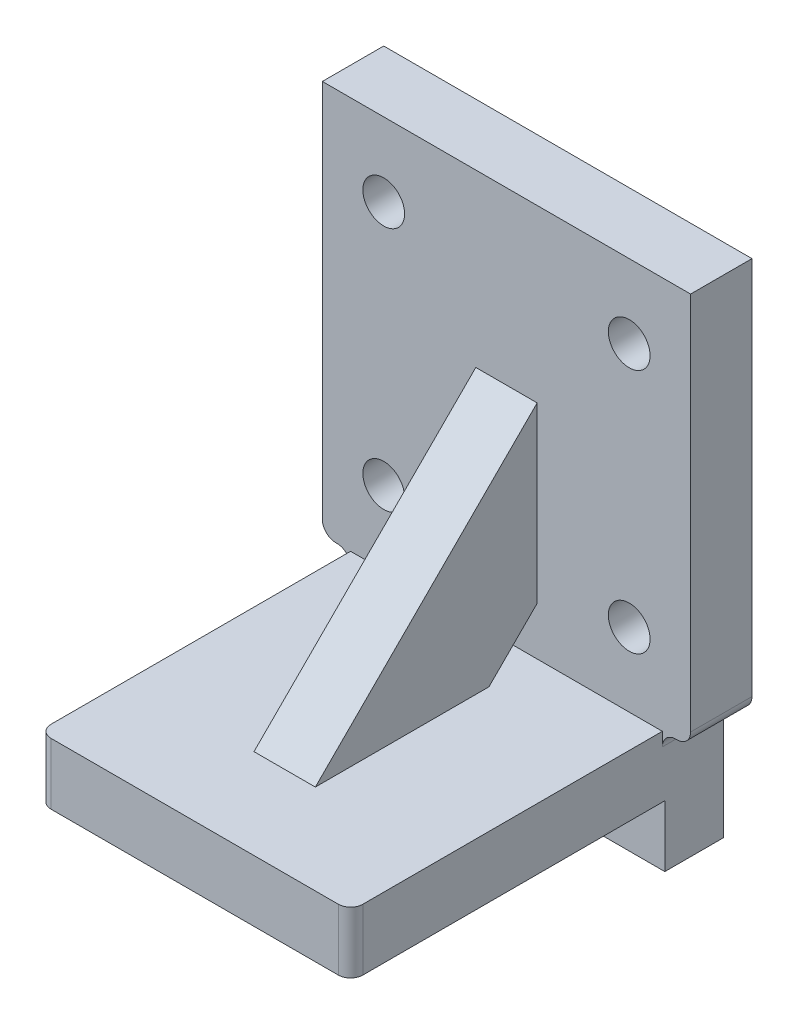
ISO-10303-21;
HEADER;
FILE_DESCRIPTION(('STEP AP214'),'2;1');
FILE_NAME('part.step','',(''),(''),'','','');
FILE_SCHEMA(('AUTOMOTIVE_DESIGN { 1 0 10303 214 1 1 1 1 }'));
ENDSEC;
DATA;
#1=APPLICATION_CONTEXT('core data for automotive mechanical design processes');
#2=APPLICATION_PROTOCOL_DEFINITION('international standard','automotive_design',2000,#1);
#3=PRODUCT_CONTEXT('',#1,'mechanical');
#4=PRODUCT('Part','Part','',(#3));
#5=PRODUCT_RELATED_PRODUCT_CATEGORY('part','',(#4));
#6=PRODUCT_DEFINITION_FORMATION('','',#4);
#7=PRODUCT_DEFINITION_CONTEXT('part definition',#1,'design');
#8=PRODUCT_DEFINITION('design','',#6,#7);
#9=PRODUCT_DEFINITION_SHAPE('','',#8);
#10=(LENGTH_UNIT() NAMED_UNIT(*) SI_UNIT(.MILLI.,.METRE.));
#11=(NAMED_UNIT(*) PLANE_ANGLE_UNIT() SI_UNIT($,.RADIAN.));
#12=(NAMED_UNIT(*) SI_UNIT($,.STERADIAN.) SOLID_ANGLE_UNIT());
#13=UNCERTAINTY_MEASURE_WITH_UNIT(LENGTH_MEASURE(1.E-05),#10,'distance_accuracy_value','');
#14=(GEOMETRIC_REPRESENTATION_CONTEXT(3) GLOBAL_UNCERTAINTY_ASSIGNED_CONTEXT((#13)) GLOBAL_UNIT_ASSIGNED_CONTEXT((#10,
#11,#12)) REPRESENTATION_CONTEXT('',''));
#15=CARTESIAN_POINT('',(0.,0.,0.));
#16=DIRECTION('',(0.,0.,1.));
#17=DIRECTION('',(1.,0.,0.));
#18=AXIS2_PLACEMENT_3D('',#15,#16,#17);
#19=CARTESIAN_POINT('',(15.,-16.,5.));
#20=DIRECTION('',(0.,1.,0.));
#21=DIRECTION('',(-1.,0.,0.));
#22=AXIS2_PLACEMENT_3D('',#19,#20,#21);
#23=PLANE('',#22);
#24=DIRECTION('',(1.,0.,0.));
#25=VECTOR('',#24,1.);
#26=CARTESIAN_POINT('',(15.,-16.,0.));
#27=LINE('',#26,#25);
#28=CARTESIAN_POINT('',(13.8,-16.,0.));
#29=VERTEX_POINT('',#28);
#30=CARTESIAN_POINT('',(13.9,-16.,0.));
#31=VERTEX_POINT('',#30);
#32=EDGE_CURVE('E355',#29,#31,#27,.T.);
#33=ORIENTED_EDGE('',*,*,#32,.T.);
#34=DIRECTION('',(0.,0.,-1.));
#35=VECTOR('',#34,1.);
#36=CARTESIAN_POINT('',(13.9,-16.,5.));
#37=LINE('',#36,#35);
#38=CARTESIAN_POINT('',(13.9,-16.,5.));
#39=VERTEX_POINT('',#38);
#40=EDGE_CURVE('E394',#31,#39,#37,.F.);
#41=ORIENTED_EDGE('',*,*,#40,.T.);
#42=DIRECTION('',(1.,0.,0.));
#43=VECTOR('',#42,1.);
#44=CARTESIAN_POINT('',(15.,-16.,5.));
#45=LINE('',#44,#43);
#46=CARTESIAN_POINT('',(13.8,-16.,5.));
#47=VERTEX_POINT('',#46);
#48=EDGE_CURVE('E343',#47,#39,#45,.T.);
#49=ORIENTED_EDGE('',*,*,#48,.F.);
#50=DIRECTION('',(0.,0.,1.));
#51=VECTOR('',#50,1.);
#52=CARTESIAN_POINT('',(13.8,-16.,0.));
#53=LINE('',#52,#51);
#54=EDGE_CURVE('E392',#47,#29,#53,.F.);
#55=ORIENTED_EDGE('',*,*,#54,.T.);
#56=EDGE_LOOP('',(#33,#41,#49,#55));
#57=FACE_BOUND('',#56,.T.);
#58=ADVANCED_FACE('F33',(#57),#23,.F.);
#59=CARTESIAN_POINT('',(-13.9,-16.,5.));
#60=VERTEX_POINT('',#59);
#61=CARTESIAN_POINT('',(-13.8,-16.,5.));
#62=VERTEX_POINT('',#61);
#63=EDGE_CURVE('E345',#60,#62,#45,.T.);
#64=ORIENTED_EDGE('',*,*,#63,.F.);
#65=DIRECTION('',(0.,0.,-1.));
#66=VECTOR('',#65,1.);
#67=CARTESIAN_POINT('',(-13.9,-16.,5.));
#68=LINE('',#67,#66);
#69=CARTESIAN_POINT('',(-13.9,-16.,0.));
#70=VERTEX_POINT('',#69);
#71=EDGE_CURVE('E402',#60,#70,#68,.T.);
#72=ORIENTED_EDGE('',*,*,#71,.T.);
#73=CARTESIAN_POINT('',(-13.8,-16.,0.));
#74=VERTEX_POINT('',#73);
#75=EDGE_CURVE('E356',#70,#74,#27,.T.);
#76=ORIENTED_EDGE('',*,*,#75,.T.);
#77=DIRECTION('',(0.,0.,-1.));
#78=VECTOR('',#77,1.);
#79=CARTESIAN_POINT('',(-13.8,-16.,5.));
#80=LINE('',#79,#78);
#81=EDGE_CURVE('E400',#74,#62,#80,.F.);
#82=ORIENTED_EDGE('',*,*,#81,.T.);
#83=EDGE_LOOP('',(#64,#72,#76,#82));
#84=FACE_BOUND('',#83,.T.);
#85=ADVANCED_FACE('F428',(#84),#23,.F.);
#86=CARTESIAN_POINT('',(-15.,-16.,5.));
#87=DIRECTION('',(1.,0.,0.));
#88=DIRECTION('',(0.,0.,-1.));
#89=AXIS2_PLACEMENT_3D('',#86,#87,#88);
#90=PLANE('',#89);
#91=DIRECTION('',(0.,-1.,0.));
#92=VECTOR('',#91,1.);
#93=CARTESIAN_POINT('',(-15.,-16.,0.));
#94=LINE('',#93,#92);
#95=CARTESIAN_POINT('',(-15.,16.,0.));
#96=VERTEX_POINT('',#95);
#97=CARTESIAN_POINT('',(-15.,-14.9,0.));
#98=VERTEX_POINT('',#97);
#99=EDGE_CURVE('E339',#96,#98,#94,.T.);
#100=ORIENTED_EDGE('',*,*,#99,.T.);
#101=DIRECTION('',(0.,0.,-1.));
#102=VECTOR('',#101,1.);
#103=CARTESIAN_POINT('',(-15.,-14.9,5.));
#104=LINE('',#103,#102);
#105=CARTESIAN_POINT('',(-15.,-14.9,5.));
#106=VERTEX_POINT('',#105);
#107=EDGE_CURVE('E405',#98,#106,#104,.F.);
#108=ORIENTED_EDGE('',*,*,#107,.T.);
#109=DIRECTION('',(0.,-1.,0.));
#110=VECTOR('',#109,1.);
#111=CARTESIAN_POINT('',(-15.,-16.,5.));
#112=LINE('',#111,#110);
#113=CARTESIAN_POINT('',(-15.,16.,5.));
#114=VERTEX_POINT('',#113);
#115=EDGE_CURVE('E340',#114,#106,#112,.T.);
#116=ORIENTED_EDGE('',*,*,#115,.F.);
#117=DIRECTION('',(0.,0.,-1.));
#118=VECTOR('',#117,1.);
#119=CARTESIAN_POINT('',(-15.,16.,5.));
#120=LINE('',#119,#118);
#121=EDGE_CURVE('E352',#114,#96,#120,.T.);
#122=ORIENTED_EDGE('',*,*,#121,.T.);
#123=EDGE_LOOP('',(#100,#108,#116,#122));
#124=FACE_BOUND('',#123,.T.);
#125=ADVANCED_FACE('F465',(#124),#90,.F.);
#126=CARTESIAN_POINT('',(15.,-16.,5.));
#127=DIRECTION('',(-1.,0.,0.));
#128=DIRECTION('',(0.,-1.,0.));
#129=AXIS2_PLACEMENT_3D('',#126,#127,#128);
#130=PLANE('',#129);
#131=DIRECTION('',(0.,1.,0.));
#132=VECTOR('',#131,1.);
#133=CARTESIAN_POINT('',(15.,-16.,5.));
#134=LINE('',#133,#132);
#135=CARTESIAN_POINT('',(15.,-14.9,5.));
#136=VERTEX_POINT('',#135);
#137=CARTESIAN_POINT('',(15.,16.,5.));
#138=VERTEX_POINT('',#137);
#139=EDGE_CURVE('E347',#136,#138,#134,.T.);
#140=ORIENTED_EDGE('',*,*,#139,.F.);
#141=DIRECTION('',(0.,0.,-1.));
#142=VECTOR('',#141,1.);
#143=CARTESIAN_POINT('',(15.,-14.9,5.));
#144=LINE('',#143,#142);
#145=CARTESIAN_POINT('',(15.,-14.9,0.));
#146=VERTEX_POINT('',#145);
#147=EDGE_CURVE('E385',#136,#146,#144,.T.);
#148=ORIENTED_EDGE('',*,*,#147,.T.);
#149=DIRECTION('',(0.,1.,0.));
#150=VECTOR('',#149,1.);
#151=CARTESIAN_POINT('',(15.,-16.,0.));
#152=LINE('',#151,#150);
#153=CARTESIAN_POINT('',(15.,16.,0.));
#154=VERTEX_POINT('',#153);
#155=EDGE_CURVE('E359',#146,#154,#152,.T.);
#156=ORIENTED_EDGE('',*,*,#155,.T.);
#157=DIRECTION('',(0.,0.,-1.));
#158=VECTOR('',#157,1.);
#159=CARTESIAN_POINT('',(15.,16.,5.));
#160=LINE('',#159,#158);
#161=EDGE_CURVE('E364',#138,#154,#160,.T.);
#162=ORIENTED_EDGE('',*,*,#161,.F.);
#163=EDGE_LOOP('',(#140,#148,#156,#162));
#164=FACE_BOUND('',#163,.T.);
#165=ADVANCED_FACE('F453',(#164),#130,.F.);
#166=CARTESIAN_POINT('',(15.,16.,5.));
#167=DIRECTION('',(0.,-1.,0.));
#168=DIRECTION('',(1.,0.,0.));
#169=AXIS2_PLACEMENT_3D('',#166,#167,#168);
#170=PLANE('',#169);
#171=DIRECTION('',(-1.,0.,0.));
#172=VECTOR('',#171,1.);
#173=CARTESIAN_POINT('',(15.,16.,0.));
#174=LINE('',#173,#172);
#175=EDGE_CURVE('E344',#154,#96,#174,.T.);
#176=ORIENTED_EDGE('',*,*,#175,.T.);
#177=ORIENTED_EDGE('',*,*,#121,.F.);
#178=DIRECTION('',(-1.,0.,0.));
#179=VECTOR('',#178,1.);
#180=CARTESIAN_POINT('',(15.,16.,5.));
#181=LINE('',#180,#179);
#182=EDGE_CURVE('E350',#138,#114,#181,.T.);
#183=ORIENTED_EDGE('',*,*,#182,.F.);
#184=ORIENTED_EDGE('',*,*,#161,.T.);
#185=EDGE_LOOP('',(#176,#177,#183,#184));
#186=FACE_BOUND('',#185,.T.);
#187=ADVANCED_FACE('F461',(#186),#170,.F.);
#188=CARTESIAN_POINT('',(0.,0.,5.));
#189=DIRECTION('',(0.,0.,1.));
#190=DIRECTION('',(1.,0.,0.));
#191=AXIS2_PLACEMENT_3D('',#188,#189,#190);
#192=PLANE('',#191);
#193=DIRECTION('',(0.,1.,0.));
#194=VECTOR('',#193,1.);
#195=CARTESIAN_POINT('',(-2.5,4.46588030762963,5.));
#196=LINE('',#195,#194);
#197=CARTESIAN_POINT('',(-2.5,-12.0710678118655,5.));
#198=VERTEX_POINT('',#197);
#199=CARTESIAN_POINT('',(-2.5,2.07106781186548,5.));
#200=VERTEX_POINT('',#199);
#201=EDGE_CURVE('E283',#198,#200,#196,.T.);
#202=ORIENTED_EDGE('',*,*,#201,.T.);
#203=DIRECTION('',(1.,0.,0.));
#204=VECTOR('',#203,1.);
#205=CARTESIAN_POINT('',(2.5,2.07106781186547,5.));
#206=LINE('',#205,#204);
#207=CARTESIAN_POINT('',(2.50000000000001,2.07106781186547,5.));
#208=VERTEX_POINT('',#207);
#209=EDGE_CURVE('E271',#200,#208,#206,.T.);
#210=ORIENTED_EDGE('',*,*,#209,.T.);
#211=DIRECTION('',(0.,-1.,0.));
#212=VECTOR('',#211,1.);
#213=CARTESIAN_POINT('',(2.5,4.46588030762964,5.));
#214=LINE('',#213,#212);
#215=CARTESIAN_POINT('',(2.5,-12.0710678118655,5.));
#216=VERTEX_POINT('',#215);
#217=EDGE_CURVE('E294',#208,#216,#214,.T.);
#218=ORIENTED_EDGE('',*,*,#217,.T.);
#219=DIRECTION('',(-1.,0.,0.));
#220=VECTOR('',#219,1.);
#221=CARTESIAN_POINT('',(2.50000000000001,-12.0710678118655,5.));
#222=LINE('',#221,#220);
#223=EDGE_CURVE('E292',#216,#198,#222,.T.);
#224=ORIENTED_EDGE('',*,*,#223,.T.);
#225=EDGE_LOOP('',(#202,#210,#218,#224));
#226=FACE_BOUND('',#225,.T.);
#227=CARTESIAN_POINT('',(-10.,10.,5.));
#228=DIRECTION('',(0.,0.,1.));
#229=DIRECTION('',(1.,0.,0.));
#230=AXIS2_PLACEMENT_3D('',#227,#228,#229);
#231=CIRCLE('',#230,1.7);
#232=CARTESIAN_POINT('',(-8.3,10.,5.));
#233=VERTEX_POINT('',#232);
#234=EDGE_CURVE('E315',#233,#233,#231,.T.);
#235=ORIENTED_EDGE('',*,*,#234,.F.);
#236=EDGE_LOOP('',(#235));
#237=FACE_BOUND('',#236,.T.);
#238=CARTESIAN_POINT('',(10.,10.,5.));
#239=DIRECTION('',(0.,0.,1.));
#240=DIRECTION('',(1.,0.,0.));
#241=AXIS2_PLACEMENT_3D('',#238,#239,#240);
#242=CIRCLE('',#241,1.7);
#243=CARTESIAN_POINT('',(11.7,10.,5.));
#244=VERTEX_POINT('',#243);
#245=EDGE_CURVE('E321',#244,#244,#242,.T.);
#246=ORIENTED_EDGE('',*,*,#245,.F.);
#247=EDGE_LOOP('',(#246));
#248=FACE_BOUND('',#247,.T.);
#249=CARTESIAN_POINT('',(10.,-10.,5.));
#250=DIRECTION('',(0.,0.,1.));
#251=DIRECTION('',(1.,0.,0.));
#252=AXIS2_PLACEMENT_3D('',#249,#250,#251);
#253=CIRCLE('',#252,1.7);
#254=CARTESIAN_POINT('',(11.7,-10.,5.));
#255=VERTEX_POINT('',#254);
#256=EDGE_CURVE('E327',#255,#255,#253,.T.);
#257=ORIENTED_EDGE('',*,*,#256,.F.);
#258=EDGE_LOOP('',(#257));
#259=FACE_BOUND('',#258,.T.);
#260=CARTESIAN_POINT('',(-10.,-10.,5.));
#261=DIRECTION('',(0.,0.,1.));
#262=DIRECTION('',(1.,0.,0.));
#263=AXIS2_PLACEMENT_3D('',#260,#261,#262);
#264=CIRCLE('',#263,1.7);
#265=CARTESIAN_POINT('',(-8.3,-10.,5.));
#266=VERTEX_POINT('',#265);
#267=EDGE_CURVE('E333',#266,#266,#264,.T.);
#268=ORIENTED_EDGE('',*,*,#267,.F.);
#269=EDGE_LOOP('',(#268));
#270=FACE_BOUND('',#269,.T.);
#271=ORIENTED_EDGE('',*,*,#48,.T.);
#272=CARTESIAN_POINT('',(13.9,-14.9,5.));
#273=DIRECTION('',(0.,0.,1.));
#274=DIRECTION('',(1.,0.,0.));
#275=AXIS2_PLACEMENT_3D('',#272,#273,#274);
#276=CIRCLE('',#275,1.1);
#277=EDGE_CURVE('E398',#39,#136,#276,.T.);
#278=ORIENTED_EDGE('',*,*,#277,.T.);
#279=ORIENTED_EDGE('',*,*,#139,.T.);
#280=ORIENTED_EDGE('',*,*,#182,.T.);
#281=ORIENTED_EDGE('',*,*,#115,.T.);
#282=CARTESIAN_POINT('',(-13.9,-14.9,5.));
#283=DIRECTION('',(0.,0.,1.));
#284=DIRECTION('',(1.,0.,0.));
#285=AXIS2_PLACEMENT_3D('',#282,#283,#284);
#286=CIRCLE('',#285,1.1);
#287=EDGE_CURVE('E396',#106,#60,#286,.T.);
#288=ORIENTED_EDGE('',*,*,#287,.T.);
#289=ORIENTED_EDGE('',*,*,#63,.T.);
#290=CARTESIAN_POINT('',(-13.8,-17.1,5.));
#291=DIRECTION('',(0.,0.,1.));
#292=DIRECTION('',(1.,0.,0.));
#293=AXIS2_PLACEMENT_3D('',#290,#291,#292);
#294=CIRCLE('',#293,1.1);
#295=CARTESIAN_POINT('',(-12.7,-17.1,5.));
#296=VERTEX_POINT('',#295);
#297=EDGE_CURVE('E11',#62,#296,#294,.F.);
#298=ORIENTED_EDGE('',*,*,#297,.T.);
#299=DIRECTION('',(0.,-1.,0.));
#300=VECTOR('',#299,1.);
#301=CARTESIAN_POINT('',(-12.7,-21.,5.));
#302=LINE('',#301,#300);
#303=CARTESIAN_POINT('',(-12.7,-16.,5.));
#304=VERTEX_POINT('',#303);
#305=EDGE_CURVE('E47',#304,#296,#302,.T.);
#306=ORIENTED_EDGE('',*,*,#305,.F.);
#307=CARTESIAN_POINT('',(12.7,-16.,5.));
#308=VERTEX_POINT('',#307);
#309=EDGE_CURVE('E348',#304,#308,#45,.T.);
#310=ORIENTED_EDGE('',*,*,#309,.T.);
#311=DIRECTION('',(0.,1.,0.));
#312=VECTOR('',#311,1.);
#313=CARTESIAN_POINT('',(12.7,-21.,5.));
#314=LINE('',#313,#312);
#315=CARTESIAN_POINT('',(12.7,-17.1,5.));
#316=VERTEX_POINT('',#315);
#317=EDGE_CURVE('E407',#316,#308,#314,.T.);
#318=ORIENTED_EDGE('',*,*,#317,.F.);
#319=CARTESIAN_POINT('',(13.8,-17.1,5.));
#320=DIRECTION('',(0.,0.,1.));
#321=DIRECTION('',(1.,0.,0.));
#322=AXIS2_PLACEMENT_3D('',#319,#320,#321);
#323=CIRCLE('',#322,1.1);
#324=EDGE_CURVE('E416',#316,#47,#323,.F.);
#325=ORIENTED_EDGE('',*,*,#324,.T.);
#326=EDGE_LOOP('',(#271,#278,#279,#280,#281,#288,#289,#298,#306,#310,#318,#325));
#327=FACE_BOUND('',#326,.T.);
#328=ADVANCED_FACE('F444',(#226,#237,#248,#259,#270,#327),#192,.T.);
#329=CARTESIAN_POINT('',(0.,0.,0.));
#330=DIRECTION('',(0.,0.,1.));
#331=DIRECTION('',(1.,0.,0.));
#332=AXIS2_PLACEMENT_3D('',#329,#330,#331);
#333=PLANE('',#332);
#334=CARTESIAN_POINT('',(-10.,10.,0.));
#335=DIRECTION('',(0.,0.,1.));
#336=DIRECTION('',(1.,0.,0.));
#337=AXIS2_PLACEMENT_3D('',#334,#335,#336);
#338=CIRCLE('',#337,1.7);
#339=CARTESIAN_POINT('',(-8.3,10.,0.));
#340=VERTEX_POINT('',#339);
#341=EDGE_CURVE('E318',#340,#340,#338,.T.);
#342=ORIENTED_EDGE('',*,*,#341,.T.);
#343=EDGE_LOOP('',(#342));
#344=FACE_BOUND('',#343,.T.);
#345=CARTESIAN_POINT('',(10.,10.,0.));
#346=DIRECTION('',(0.,0.,1.));
#347=DIRECTION('',(1.,0.,0.));
#348=AXIS2_PLACEMENT_3D('',#345,#346,#347);
#349=CIRCLE('',#348,1.7);
#350=CARTESIAN_POINT('',(11.7,10.,0.));
#351=VERTEX_POINT('',#350);
#352=EDGE_CURVE('E324',#351,#351,#349,.T.);
#353=ORIENTED_EDGE('',*,*,#352,.T.);
#354=EDGE_LOOP('',(#353));
#355=FACE_BOUND('',#354,.T.);
#356=CARTESIAN_POINT('',(10.,-10.,0.));
#357=DIRECTION('',(0.,0.,1.));
#358=DIRECTION('',(1.,0.,0.));
#359=AXIS2_PLACEMENT_3D('',#356,#357,#358);
#360=CIRCLE('',#359,1.7);
#361=CARTESIAN_POINT('',(11.7,-10.,0.));
#362=VERTEX_POINT('',#361);
#363=EDGE_CURVE('E330',#362,#362,#360,.T.);
#364=ORIENTED_EDGE('',*,*,#363,.T.);
#365=EDGE_LOOP('',(#364));
#366=FACE_BOUND('',#365,.T.);
#367=CARTESIAN_POINT('',(-10.,-10.,0.));
#368=DIRECTION('',(0.,0.,1.));
#369=DIRECTION('',(1.,0.,0.));
#370=AXIS2_PLACEMENT_3D('',#367,#368,#369);
#371=CIRCLE('',#370,1.7);
#372=CARTESIAN_POINT('',(-8.3,-10.,0.));
#373=VERTEX_POINT('',#372);
#374=EDGE_CURVE('E336',#373,#373,#371,.T.);
#375=ORIENTED_EDGE('',*,*,#374,.T.);
#376=EDGE_LOOP('',(#375));
#377=FACE_BOUND('',#376,.T.);
#378=ORIENTED_EDGE('',*,*,#155,.F.);
#379=CARTESIAN_POINT('',(13.9,-14.9,0.));
#380=DIRECTION('',(0.,0.,1.));
#381=DIRECTION('',(1.,0.,0.));
#382=AXIS2_PLACEMENT_3D('',#379,#380,#381);
#383=CIRCLE('',#382,1.1);
#384=EDGE_CURVE('E390',#146,#31,#383,.F.);
#385=ORIENTED_EDGE('',*,*,#384,.T.);
#386=ORIENTED_EDGE('',*,*,#32,.F.);
#387=CARTESIAN_POINT('',(13.8,-17.1,0.));
#388=DIRECTION('',(0.,0.,1.));
#389=DIRECTION('',(1.,0.,0.));
#390=AXIS2_PLACEMENT_3D('',#387,#388,#389);
#391=CIRCLE('',#390,1.1);
#392=CARTESIAN_POINT('',(12.7,-17.1,0.));
#393=VERTEX_POINT('',#392);
#394=EDGE_CURVE('E418',#29,#393,#391,.T.);
#395=ORIENTED_EDGE('',*,*,#394,.T.);
#396=DIRECTION('',(0.,1.,0.));
#397=VECTOR('',#396,1.);
#398=CARTESIAN_POINT('',(12.7,-21.,0.));
#399=LINE('',#398,#397);
#400=CARTESIAN_POINT('',(12.7,-26.,0.));
#401=VERTEX_POINT('',#400);
#402=EDGE_CURVE('E304',#401,#393,#399,.T.);
#403=ORIENTED_EDGE('',*,*,#402,.F.);
#404=DIRECTION('',(1.,0.,0.));
#405=VECTOR('',#404,1.);
#406=CARTESIAN_POINT('',(12.7,-26.,0.));
#407=LINE('',#406,#405);
#408=CARTESIAN_POINT('',(-12.7,-26.,0.));
#409=VERTEX_POINT('',#408);
#410=EDGE_CURVE('E222',#409,#401,#407,.T.);
#411=ORIENTED_EDGE('',*,*,#410,.F.);
#412=DIRECTION('',(0.,1.,0.));
#413=VECTOR('',#412,1.);
#414=CARTESIAN_POINT('',(-12.7,-21.,0.));
#415=LINE('',#414,#413);
#416=CARTESIAN_POINT('',(-12.7,-17.1,0.));
#417=VERTEX_POINT('',#416);
#418=EDGE_CURVE('E312',#409,#417,#415,.T.);
#419=ORIENTED_EDGE('',*,*,#418,.T.);
#420=CARTESIAN_POINT('',(-13.8,-17.1,0.));
#421=DIRECTION('',(0.,0.,1.));
#422=DIRECTION('',(1.,0.,0.));
#423=AXIS2_PLACEMENT_3D('',#420,#421,#422);
#424=CIRCLE('',#423,1.1);
#425=EDGE_CURVE('E41',#417,#74,#424,.T.);
#426=ORIENTED_EDGE('',*,*,#425,.T.);
#427=ORIENTED_EDGE('',*,*,#75,.F.);
#428=CARTESIAN_POINT('',(-13.9,-14.9,0.));
#429=DIRECTION('',(0.,0.,1.));
#430=DIRECTION('',(1.,0.,0.));
#431=AXIS2_PLACEMENT_3D('',#428,#429,#430);
#432=CIRCLE('',#431,1.1);
#433=EDGE_CURVE('E388',#70,#98,#432,.F.);
#434=ORIENTED_EDGE('',*,*,#433,.T.);
#435=ORIENTED_EDGE('',*,*,#99,.F.);
#436=ORIENTED_EDGE('',*,*,#175,.F.);
#437=EDGE_LOOP('',(#378,#385,#386,#395,#403,#411,#419,#426,#427,#434,#435,#436));
#438=FACE_BOUND('',#437,.T.);
#439=ADVANCED_FACE('F422',(#344,#355,#366,#377,#438),#333,.F.);
#440=CARTESIAN_POINT('',(-10.,-10.,5.));
#441=DIRECTION('',(0.,0.,1.));
#442=DIRECTION('',(1.,0.,0.));
#443=AXIS2_PLACEMENT_3D('',#440,#441,#442);
#444=CYLINDRICAL_SURFACE('',#443,1.7);
#445=ORIENTED_EDGE('',*,*,#374,.F.);
#446=EDGE_LOOP('',(#445));
#447=FACE_BOUND('',#446,.T.);
#448=ORIENTED_EDGE('',*,*,#267,.T.);
#449=EDGE_LOOP('',(#448));
#450=FACE_BOUND('',#449,.T.);
#451=ADVANCED_FACE('F535',(#447,#450),#444,.F.);
#452=CARTESIAN_POINT('',(10.,-10.,5.));
#453=DIRECTION('',(0.,0.,1.));
#454=DIRECTION('',(1.,0.,0.));
#455=AXIS2_PLACEMENT_3D('',#452,#453,#454);
#456=CYLINDRICAL_SURFACE('',#455,1.7);
#457=ORIENTED_EDGE('',*,*,#363,.F.);
#458=EDGE_LOOP('',(#457));
#459=FACE_BOUND('',#458,.T.);
#460=ORIENTED_EDGE('',*,*,#256,.T.);
#461=EDGE_LOOP('',(#460));
#462=FACE_BOUND('',#461,.T.);
#463=ADVANCED_FACE('F531',(#459,#462),#456,.F.);
#464=CARTESIAN_POINT('',(10.,10.,5.));
#465=DIRECTION('',(0.,0.,1.));
#466=DIRECTION('',(1.,0.,0.));
#467=AXIS2_PLACEMENT_3D('',#464,#465,#466);
#468=CYLINDRICAL_SURFACE('',#467,1.7);
#469=ORIENTED_EDGE('',*,*,#352,.F.);
#470=EDGE_LOOP('',(#469));
#471=FACE_BOUND('',#470,.T.);
#472=ORIENTED_EDGE('',*,*,#245,.T.);
#473=EDGE_LOOP('',(#472));
#474=FACE_BOUND('',#473,.T.);
#475=ADVANCED_FACE('F527',(#471,#474),#468,.F.);
#476=CARTESIAN_POINT('',(-10.,10.,5.));
#477=DIRECTION('',(0.,0.,1.));
#478=DIRECTION('',(1.,0.,0.));
#479=AXIS2_PLACEMENT_3D('',#476,#477,#478);
#480=CYLINDRICAL_SURFACE('',#479,1.7);
#481=ORIENTED_EDGE('',*,*,#341,.F.);
#482=EDGE_LOOP('',(#481));
#483=FACE_BOUND('',#482,.T.);
#484=ORIENTED_EDGE('',*,*,#234,.T.);
#485=EDGE_LOOP('',(#484));
#486=FACE_BOUND('',#485,.T.);
#487=ADVANCED_FACE('F521',(#483,#486),#480,.F.);
#488=CARTESIAN_POINT('',(12.7,-21.,0.));
#489=DIRECTION('',(-1.,0.,0.));
#490=DIRECTION('',(0.,-1.,0.));
#491=AXIS2_PLACEMENT_3D('',#488,#489,#490);
#492=PLANE('',#491);
#493=ORIENTED_EDGE('',*,*,#402,.T.);
#494=DIRECTION('',(0.,0.,1.));
#495=VECTOR('',#494,1.);
#496=CARTESIAN_POINT('',(12.7,-17.1,5.));
#497=LINE('',#496,#495);
#498=EDGE_CURVE('E409',#393,#316,#497,.T.);
#499=ORIENTED_EDGE('',*,*,#498,.T.);
#500=ORIENTED_EDGE('',*,*,#317,.T.);
#501=DIRECTION('',(0.,0.,1.));
#502=VECTOR('',#501,1.);
#503=CARTESIAN_POINT('',(12.7,-16.,0.));
#504=LINE('',#503,#502);
#505=CARTESIAN_POINT('',(12.7,-16.,29.4));
#506=VERTEX_POINT('',#505);
#507=EDGE_CURVE('E290',#308,#506,#504,.T.);
#508=ORIENTED_EDGE('',*,*,#507,.T.);
#509=DIRECTION('',(0.,1.,0.));
#510=VECTOR('',#509,1.);
#511=CARTESIAN_POINT('',(12.7,-21.,29.4));
#512=LINE('',#511,#510);
#513=CARTESIAN_POINT('',(12.7,-21.,29.4));
#514=VERTEX_POINT('',#513);
#515=EDGE_CURVE('E376',#506,#514,#512,.F.);
#516=ORIENTED_EDGE('',*,*,#515,.T.);
#517=DIRECTION('',(0.,0.,1.));
#518=VECTOR('',#517,1.);
#519=CARTESIAN_POINT('',(12.7,-21.,0.));
#520=LINE('',#519,#518);
#521=CARTESIAN_POINT('',(12.7,-21.,4.8));
#522=VERTEX_POINT('',#521);
#523=EDGE_CURVE('E230',#522,#514,#520,.T.);
#524=ORIENTED_EDGE('',*,*,#523,.F.);
#525=DIRECTION('',(0.,1.,0.));
#526=VECTOR('',#525,1.);
#527=CARTESIAN_POINT('',(12.7,-26.,4.8));
#528=LINE('',#527,#526);
#529=CARTESIAN_POINT('',(12.7,-26.,4.8));
#530=VERTEX_POINT('',#529);
#531=EDGE_CURVE('E209',#530,#522,#528,.T.);
#532=ORIENTED_EDGE('',*,*,#531,.F.);
#533=DIRECTION('',(0.,0.,1.));
#534=VECTOR('',#533,1.);
#535=CARTESIAN_POINT('',(12.7,-26.,0.));
#536=LINE('',#535,#534);
#537=EDGE_CURVE('E216',#401,#530,#536,.T.);
#538=ORIENTED_EDGE('',*,*,#537,.F.);
#539=EDGE_LOOP('',(#493,#499,#500,#508,#516,#524,#532,#538));
#540=FACE_BOUND('',#539,.T.);
#541=ADVANCED_FACE('F228',(#540),#492,.F.);
#542=CARTESIAN_POINT('',(12.7,-21.,30.4));
#543=DIRECTION('',(0.,0.,-1.));
#544=DIRECTION('',(-1.,0.,0.));
#545=AXIS2_PLACEMENT_3D('',#542,#543,#544);
#546=PLANE('',#545);
#547=DIRECTION('',(-1.,0.,0.));
#548=VECTOR('',#547,1.);
#549=CARTESIAN_POINT('',(12.7,-21.,30.4));
#550=LINE('',#549,#548);
#551=CARTESIAN_POINT('',(11.7,-21.,30.4));
#552=VERTEX_POINT('',#551);
#553=CARTESIAN_POINT('',(-11.7,-21.,30.4));
#554=VERTEX_POINT('',#553);
#555=EDGE_CURVE('E298',#552,#554,#550,.T.);
#556=ORIENTED_EDGE('',*,*,#555,.F.);
#557=DIRECTION('',(0.,1.,0.));
#558=VECTOR('',#557,1.);
#559=CARTESIAN_POINT('',(11.7,-21.,30.4));
#560=LINE('',#559,#558);
#561=CARTESIAN_POINT('',(11.7,-16.,30.4));
#562=VERTEX_POINT('',#561);
#563=EDGE_CURVE('E369',#552,#562,#560,.T.);
#564=ORIENTED_EDGE('',*,*,#563,.T.);
#565=DIRECTION('',(-1.,0.,0.));
#566=VECTOR('',#565,1.);
#567=CARTESIAN_POINT('',(12.7,-16.,30.4));
#568=LINE('',#567,#566);
#569=CARTESIAN_POINT('',(-11.7,-16.,30.4));
#570=VERTEX_POINT('',#569);
#571=EDGE_CURVE('E307',#562,#570,#568,.T.);
#572=ORIENTED_EDGE('',*,*,#571,.T.);
#573=DIRECTION('',(0.,1.,0.));
#574=VECTOR('',#573,1.);
#575=CARTESIAN_POINT('',(-11.7,-21.,30.4));
#576=LINE('',#575,#574);
#577=EDGE_CURVE('E367',#570,#554,#576,.F.);
#578=ORIENTED_EDGE('',*,*,#577,.T.);
#579=EDGE_LOOP('',(#556,#564,#572,#578));
#580=FACE_BOUND('',#579,.T.);
#581=ADVANCED_FACE('F513',(#580),#546,.F.);
#582=CARTESIAN_POINT('',(-12.7,-21.,0.));
#583=DIRECTION('',(1.,0.,0.));
#584=DIRECTION('',(0.,1.,0.));
#585=AXIS2_PLACEMENT_3D('',#582,#583,#584);
#586=PLANE('',#585);
#587=ORIENTED_EDGE('',*,*,#305,.T.);
#588=DIRECTION('',(0.,0.,-1.));
#589=VECTOR('',#588,1.);
#590=CARTESIAN_POINT('',(-12.7,-17.1,0.));
#591=LINE('',#590,#589);
#592=EDGE_CURVE('E413',#296,#417,#591,.T.);
#593=ORIENTED_EDGE('',*,*,#592,.T.);
#594=ORIENTED_EDGE('',*,*,#418,.F.);
#595=DIRECTION('',(0.,0.,-1.));
#596=VECTOR('',#595,1.);
#597=CARTESIAN_POINT('',(-12.7,-26.,0.));
#598=LINE('',#597,#596);
#599=CARTESIAN_POINT('',(-12.7,-26.,4.8));
#600=VERTEX_POINT('',#599);
#601=EDGE_CURVE('E215',#600,#409,#598,.T.);
#602=ORIENTED_EDGE('',*,*,#601,.F.);
#603=DIRECTION('',(0.,1.,0.));
#604=VECTOR('',#603,1.);
#605=CARTESIAN_POINT('',(-12.7,-26.,4.8));
#606=LINE('',#605,#604);
#607=CARTESIAN_POINT('',(-12.7,-21.,4.8));
#608=VERTEX_POINT('',#607);
#609=EDGE_CURVE('E211',#600,#608,#606,.T.);
#610=ORIENTED_EDGE('',*,*,#609,.T.);
#611=DIRECTION('',(0.,0.,-1.));
#612=VECTOR('',#611,1.);
#613=CARTESIAN_POINT('',(-12.7,-21.,0.));
#614=LINE('',#613,#612);
#615=CARTESIAN_POINT('',(-12.7,-21.,29.4));
#616=VERTEX_POINT('',#615);
#617=EDGE_CURVE('E302',#616,#608,#614,.T.);
#618=ORIENTED_EDGE('',*,*,#617,.F.);
#619=DIRECTION('',(0.,1.,0.));
#620=VECTOR('',#619,1.);
#621=CARTESIAN_POINT('',(-12.7,-21.,29.4));
#622=LINE('',#621,#620);
#623=CARTESIAN_POINT('',(-12.7,-16.,29.4));
#624=VERTEX_POINT('',#623);
#625=EDGE_CURVE('E382',#616,#624,#622,.T.);
#626=ORIENTED_EDGE('',*,*,#625,.T.);
#627=DIRECTION('',(0.,0.,-1.));
#628=VECTOR('',#627,1.);
#629=CARTESIAN_POINT('',(-12.7,-16.,0.));
#630=LINE('',#629,#628);
#631=EDGE_CURVE('E299',#624,#304,#630,.T.);
#632=ORIENTED_EDGE('',*,*,#631,.T.);
#633=EDGE_LOOP('',(#587,#593,#594,#602,#610,#618,#626,#632));
#634=FACE_BOUND('',#633,.T.);
#635=ADVANCED_FACE('F431',(#634),#586,.F.);
#636=CARTESIAN_POINT('',(0.,-21.,0.));
#637=DIRECTION('',(0.,-1.,0.));
#638=DIRECTION('',(1.,0.,0.));
#639=AXIS2_PLACEMENT_3D('',#636,#637,#638);
#640=PLANE('',#639);
#641=DIRECTION('',(-1.,0.,0.));
#642=VECTOR('',#641,1.);
#643=CARTESIAN_POINT('',(12.7,-21.,4.8));
#644=LINE('',#643,#642);
#645=EDGE_CURVE('E225',#522,#608,#644,.T.);
#646=ORIENTED_EDGE('',*,*,#645,.F.);
#647=ORIENTED_EDGE('',*,*,#523,.T.);
#648=CARTESIAN_POINT('',(11.7,-21.,29.4));
#649=DIRECTION('',(0.,-1.,0.));
#650=DIRECTION('',(1.,0.,0.));
#651=AXIS2_PLACEMENT_3D('',#648,#649,#650);
#652=CIRCLE('',#651,1.);
#653=EDGE_CURVE('E380',#514,#552,#652,.T.);
#654=ORIENTED_EDGE('',*,*,#653,.T.);
#655=ORIENTED_EDGE('',*,*,#555,.T.);
#656=CARTESIAN_POINT('',(-11.7,-21.,29.4));
#657=DIRECTION('',(0.,-1.,0.));
#658=DIRECTION('',(1.,0.,0.));
#659=AXIS2_PLACEMENT_3D('',#656,#657,#658);
#660=CIRCLE('',#659,1.);
#661=EDGE_CURVE('E378',#554,#616,#660,.T.);
#662=ORIENTED_EDGE('',*,*,#661,.T.);
#663=ORIENTED_EDGE('',*,*,#617,.T.);
#664=EDGE_LOOP('',(#646,#647,#654,#655,#662,#663));
#665=FACE_BOUND('',#664,.T.);
#666=DIRECTION('',(0.,0.,1.));
#667=VECTOR('',#666,1.);
#668=CARTESIAN_POINT('',(3.20000000000001,-21.,24.2));
#669=LINE('',#668,#667);
#670=CARTESIAN_POINT('',(3.20000000000001,-21.,5.));
#671=VERTEX_POINT('',#670);
#672=CARTESIAN_POINT('',(3.20000000000001,-21.,24.2));
#673=VERTEX_POINT('',#672);
#674=EDGE_CURVE('E231',#671,#673,#669,.T.);
#675=ORIENTED_EDGE('',*,*,#674,.F.);
#676=DIRECTION('',(1.,0.,0.));
#677=VECTOR('',#676,1.);
#678=CARTESIAN_POINT('',(-3.19999999999999,-21.,5.));
#679=LINE('',#678,#677);
#680=CARTESIAN_POINT('',(-3.19999999999999,-21.,5.));
#681=VERTEX_POINT('',#680);
#682=EDGE_CURVE('E242',#681,#671,#679,.T.);
#683=ORIENTED_EDGE('',*,*,#682,.F.);
#684=DIRECTION('',(0.,0.,-1.));
#685=VECTOR('',#684,1.);
#686=CARTESIAN_POINT('',(-3.19999999999999,-21.,24.2));
#687=LINE('',#686,#685);
#688=CARTESIAN_POINT('',(-3.19999999999999,-21.,24.2));
#689=VERTEX_POINT('',#688);
#690=EDGE_CURVE('E254',#689,#681,#687,.T.);
#691=ORIENTED_EDGE('',*,*,#690,.F.);
#692=DIRECTION('',(-1.,0.,0.));
#693=VECTOR('',#692,1.);
#694=CARTESIAN_POINT('',(-3.19999999999999,-21.,24.2));
#695=LINE('',#694,#693);
#696=EDGE_CURVE('E233',#673,#689,#695,.T.);
#697=ORIENTED_EDGE('',*,*,#696,.F.);
#698=EDGE_LOOP('',(#675,#683,#691,#697));
#699=FACE_BOUND('',#698,.T.);
#700=ADVANCED_FACE('F504',(#665,#699),#640,.T.);
#701=CARTESIAN_POINT('',(0.,-16.,0.));
#702=DIRECTION('',(0.,-1.,0.));
#703=DIRECTION('',(1.,0.,0.));
#704=AXIS2_PLACEMENT_3D('',#701,#702,#703);
#705=PLANE('',#704);
#706=DIRECTION('',(-1.,0.,0.));
#707=VECTOR('',#706,1.);
#708=CARTESIAN_POINT('',(2.5,-16.,23.0710678118655));
#709=LINE('',#708,#707);
#710=CARTESIAN_POINT('',(2.50000000000001,-16.,23.0710678118655));
#711=VERTEX_POINT('',#710);
#712=CARTESIAN_POINT('',(-2.5,-16.,23.0710678118655));
#713=VERTEX_POINT('',#712);
#714=EDGE_CURVE('E268',#711,#713,#709,.T.);
#715=ORIENTED_EDGE('',*,*,#714,.T.);
#716=DIRECTION('',(0.,0.,-1.));
#717=VECTOR('',#716,1.);
#718=CARTESIAN_POINT('',(-2.49999999999999,-16.,22.1658803076296));
#719=LINE('',#718,#717);
#720=CARTESIAN_POINT('',(-2.5,-16.,8.92893218813452));
#721=VERTEX_POINT('',#720);
#722=EDGE_CURVE('E261',#713,#721,#719,.T.);
#723=ORIENTED_EDGE('',*,*,#722,.T.);
#724=DIRECTION('',(1.,0.,0.));
#725=VECTOR('',#724,1.);
#726=CARTESIAN_POINT('',(2.50000000000001,-16.,8.92893218813452));
#727=LINE('',#726,#725);
#728=CARTESIAN_POINT('',(2.5,-16.,8.92893218813452));
#729=VERTEX_POINT('',#728);
#730=EDGE_CURVE('E275',#721,#729,#727,.T.);
#731=ORIENTED_EDGE('',*,*,#730,.T.);
#732=DIRECTION('',(0.,0.,1.));
#733=VECTOR('',#732,1.);
#734=CARTESIAN_POINT('',(2.50000000000001,-16.,22.1658803076296));
#735=LINE('',#734,#733);
#736=EDGE_CURVE('E272',#729,#711,#735,.T.);
#737=ORIENTED_EDGE('',*,*,#736,.T.);
#738=EDGE_LOOP('',(#715,#723,#731,#737));
#739=FACE_BOUND('',#738,.T.);
#740=ORIENTED_EDGE('',*,*,#571,.F.);
#741=CARTESIAN_POINT('',(11.7,-16.,29.4));
#742=DIRECTION('',(0.,-1.,0.));
#743=DIRECTION('',(1.,0.,0.));
#744=AXIS2_PLACEMENT_3D('',#741,#742,#743);
#745=CIRCLE('',#744,1.);
#746=EDGE_CURVE('E374',#562,#506,#745,.F.);
#747=ORIENTED_EDGE('',*,*,#746,.T.);
#748=ORIENTED_EDGE('',*,*,#507,.F.);
#749=ORIENTED_EDGE('',*,*,#309,.F.);
#750=ORIENTED_EDGE('',*,*,#631,.F.);
#751=CARTESIAN_POINT('',(-11.7,-16.,29.4));
#752=DIRECTION('',(0.,-1.,0.));
#753=DIRECTION('',(1.,0.,0.));
#754=AXIS2_PLACEMENT_3D('',#751,#752,#753);
#755=CIRCLE('',#754,1.);
#756=EDGE_CURVE('E372',#624,#570,#755,.F.);
#757=ORIENTED_EDGE('',*,*,#756,.T.);
#758=EDGE_LOOP('',(#740,#747,#748,#749,#750,#757));
#759=FACE_BOUND('',#758,.T.);
#760=ADVANCED_FACE('F439',(#739,#759),#705,.F.);
#761=CARTESIAN_POINT('',(-2.5,4.46588030762963,-11.5369481194951));
#762=DIRECTION('',(-1.,0.,0.));
#763=DIRECTION('',(0.,0.,1.));
#764=AXIS2_PLACEMENT_3D('',#761,#762,#763);
#765=PLANE('',#764);
#766=ORIENTED_EDGE('',*,*,#201,.F.);
#767=DIRECTION('',(0.,-0.707106781186547,0.707106781186547));
#768=VECTOR('',#767,1.);
#769=CARTESIAN_POINT('',(-2.5,4.46588030762963,-11.5369481194951));
#770=LINE('',#769,#768);
#771=EDGE_CURVE('E280',#198,#721,#770,.T.);
#772=ORIENTED_EDGE('',*,*,#771,.T.);
#773=ORIENTED_EDGE('',*,*,#722,.F.);
#774=DIRECTION('',(0.,-0.707106781186547,0.707106781186547));
#775=VECTOR('',#774,1.);
#776=CARTESIAN_POINT('',(-2.5,11.5369481194951,-4.46588030762964));
#777=LINE('',#776,#775);
#778=EDGE_CURVE('E287',#200,#713,#777,.T.);
#779=ORIENTED_EDGE('',*,*,#778,.F.);
#780=EDGE_LOOP('',(#766,#772,#773,#779));
#781=FACE_BOUND('',#780,.T.);
#782=ADVANCED_FACE('F612',(#781),#765,.T.);
#783=CARTESIAN_POINT('',(2.5,4.46588030762964,-11.5369481194951));
#784=DIRECTION('',(0.,-0.707106781186547,-0.707106781186547));
#785=DIRECTION('',(0.,0.707106781186547,-0.707106781186548));
#786=AXIS2_PLACEMENT_3D('',#783,#784,#785);
#787=PLANE('',#786);
#788=ORIENTED_EDGE('',*,*,#223,.F.);
#789=DIRECTION('',(0.,-0.707106781186547,0.707106781186547));
#790=VECTOR('',#789,1.);
#791=CARTESIAN_POINT('',(2.5,4.46588030762964,-11.5369481194951));
#792=LINE('',#791,#790);
#793=EDGE_CURVE('E282',#216,#729,#792,.T.);
#794=ORIENTED_EDGE('',*,*,#793,.T.);
#795=ORIENTED_EDGE('',*,*,#730,.F.);
#796=ORIENTED_EDGE('',*,*,#771,.F.);
#797=EDGE_LOOP('',(#788,#794,#795,#796));
#798=FACE_BOUND('',#797,.T.);
#799=ADVANCED_FACE('F687',(#798),#787,.T.);
#800=CARTESIAN_POINT('',(2.5,4.46588030762964,-11.5369481194951));
#801=DIRECTION('',(1.,0.,0.));
#802=DIRECTION('',(0.,0.,-1.));
#803=AXIS2_PLACEMENT_3D('',#800,#801,#802);
#804=PLANE('',#803);
#805=ORIENTED_EDGE('',*,*,#217,.F.);
#806=DIRECTION('',(0.,-0.707106781186547,0.707106781186547));
#807=VECTOR('',#806,1.);
#808=CARTESIAN_POINT('',(2.5,11.5369481194951,-4.46588030762964));
#809=LINE('',#808,#807);
#810=EDGE_CURVE('E285',#208,#711,#809,.T.);
#811=ORIENTED_EDGE('',*,*,#810,.T.);
#812=ORIENTED_EDGE('',*,*,#736,.F.);
#813=ORIENTED_EDGE('',*,*,#793,.F.);
#814=EDGE_LOOP('',(#805,#811,#812,#813));
#815=FACE_BOUND('',#814,.T.);
#816=ADVANCED_FACE('F677',(#815),#804,.T.);
#817=CARTESIAN_POINT('',(2.5,11.5369481194951,-4.46588030762964));
#818=DIRECTION('',(0.,0.707106781186547,0.707106781186547));
#819=DIRECTION('',(0.,-0.707106781186547,0.707106781186548));
#820=AXIS2_PLACEMENT_3D('',#817,#818,#819);
#821=PLANE('',#820);
#822=ORIENTED_EDGE('',*,*,#209,.F.);
#823=ORIENTED_EDGE('',*,*,#778,.T.);
#824=ORIENTED_EDGE('',*,*,#714,.F.);
#825=ORIENTED_EDGE('',*,*,#810,.F.);
#826=EDGE_LOOP('',(#822,#823,#824,#825));
#827=FACE_BOUND('',#826,.T.);
#828=ADVANCED_FACE('F614',(#827),#821,.T.);
#829=CARTESIAN_POINT('',(3.20000000000001,-18.3,24.2));
#830=DIRECTION('',(1.,0.,0.));
#831=DIRECTION('',(0.,1.,0.));
#832=AXIS2_PLACEMENT_3D('',#829,#830,#831);
#833=PLANE('',#832);
#834=ORIENTED_EDGE('',*,*,#674,.T.);
#835=DIRECTION('',(0.,-1.,0.));
#836=VECTOR('',#835,1.);
#837=CARTESIAN_POINT('',(3.20000000000001,-18.3,24.2));
#838=LINE('',#837,#836);
#839=CARTESIAN_POINT('',(3.20000000000001,-18.3,24.2));
#840=VERTEX_POINT('',#839);
#841=EDGE_CURVE('E250',#840,#673,#838,.T.);
#842=ORIENTED_EDGE('',*,*,#841,.F.);
#843=DIRECTION('',(0.,0.,1.));
#844=VECTOR('',#843,1.);
#845=CARTESIAN_POINT('',(3.20000000000001,-18.3,24.2));
#846=LINE('',#845,#844);
#847=CARTESIAN_POINT('',(3.20000000000001,-18.3,5.));
#848=VERTEX_POINT('',#847);
#849=EDGE_CURVE('E238',#848,#840,#846,.T.);
#850=ORIENTED_EDGE('',*,*,#849,.F.);
#851=DIRECTION('',(0.,-1.,0.));
#852=VECTOR('',#851,1.);
#853=CARTESIAN_POINT('',(3.20000000000001,-18.3,5.));
#854=LINE('',#853,#852);
#855=EDGE_CURVE('E259',#848,#671,#854,.T.);
#856=ORIENTED_EDGE('',*,*,#855,.T.);
#857=EDGE_LOOP('',(#834,#842,#850,#856));
#858=FACE_BOUND('',#857,.T.);
#859=ADVANCED_FACE('F658',(#858),#833,.F.);
#860=CARTESIAN_POINT('',(-3.19999999999999,-18.3,5.));
#861=DIRECTION('',(0.,0.,-1.));
#862=DIRECTION('',(-1.,0.,0.));
#863=AXIS2_PLACEMENT_3D('',#860,#861,#862);
#864=PLANE('',#863);
#865=ORIENTED_EDGE('',*,*,#682,.T.);
#866=ORIENTED_EDGE('',*,*,#855,.F.);
#867=DIRECTION('',(1.,0.,0.));
#868=VECTOR('',#867,1.);
#869=CARTESIAN_POINT('',(-3.19999999999999,-18.3,5.));
#870=LINE('',#869,#868);
#871=CARTESIAN_POINT('',(-3.19999999999999,-18.3,5.));
#872=VERTEX_POINT('',#871);
#873=EDGE_CURVE('E248',#872,#848,#870,.T.);
#874=ORIENTED_EDGE('',*,*,#873,.F.);
#875=DIRECTION('',(0.,-1.,0.));
#876=VECTOR('',#875,1.);
#877=CARTESIAN_POINT('',(-3.19999999999999,-18.3,5.));
#878=LINE('',#877,#876);
#879=EDGE_CURVE('E262',#872,#681,#878,.T.);
#880=ORIENTED_EDGE('',*,*,#879,.T.);
#881=EDGE_LOOP('',(#865,#866,#874,#880));
#882=FACE_BOUND('',#881,.T.);
#883=ADVANCED_FACE('F648',(#882),#864,.F.);
#884=CARTESIAN_POINT('',(-3.19999999999999,-18.3,24.2));
#885=DIRECTION('',(-1.,0.,0.));
#886=DIRECTION('',(0.,-1.,0.));
#887=AXIS2_PLACEMENT_3D('',#884,#885,#886);
#888=PLANE('',#887);
#889=ORIENTED_EDGE('',*,*,#690,.T.);
#890=ORIENTED_EDGE('',*,*,#879,.F.);
#891=DIRECTION('',(0.,0.,-1.));
#892=VECTOR('',#891,1.);
#893=CARTESIAN_POINT('',(-3.19999999999999,-18.3,24.2));
#894=LINE('',#893,#892);
#895=CARTESIAN_POINT('',(-3.19999999999999,-18.3,24.2));
#896=VERTEX_POINT('',#895);
#897=EDGE_CURVE('E245',#896,#872,#894,.T.);
#898=ORIENTED_EDGE('',*,*,#897,.F.);
#899=DIRECTION('',(0.,-1.,0.));
#900=VECTOR('',#899,1.);
#901=CARTESIAN_POINT('',(-3.19999999999999,-18.3,24.2));
#902=LINE('',#901,#900);
#903=EDGE_CURVE('E264',#896,#689,#902,.T.);
#904=ORIENTED_EDGE('',*,*,#903,.T.);
#905=EDGE_LOOP('',(#889,#890,#898,#904));
#906=FACE_BOUND('',#905,.T.);
#907=ADVANCED_FACE('F638',(#906),#888,.F.);
#908=CARTESIAN_POINT('',(-3.19999999999999,-18.3,24.2));
#909=DIRECTION('',(0.,0.,1.));
#910=DIRECTION('',(1.,0.,0.));
#911=AXIS2_PLACEMENT_3D('',#908,#909,#910);
#912=PLANE('',#911);
#913=ORIENTED_EDGE('',*,*,#696,.T.);
#914=ORIENTED_EDGE('',*,*,#903,.F.);
#915=DIRECTION('',(-1.,0.,0.));
#916=VECTOR('',#915,1.);
#917=CARTESIAN_POINT('',(-3.19999999999999,-18.3,24.2));
#918=LINE('',#917,#916);
#919=EDGE_CURVE('E241',#840,#896,#918,.T.);
#920=ORIENTED_EDGE('',*,*,#919,.F.);
#921=ORIENTED_EDGE('',*,*,#841,.T.);
#922=EDGE_LOOP('',(#913,#914,#920,#921));
#923=FACE_BOUND('',#922,.T.);
#924=ADVANCED_FACE('F628',(#923),#912,.F.);
#925=CARTESIAN_POINT('',(0.,-18.3,0.));
#926=DIRECTION('',(0.,-1.,0.));
#927=DIRECTION('',(0.,0.,-1.));
#928=AXIS2_PLACEMENT_3D('',#925,#926,#927);
#929=PLANE('',#928);
#930=ORIENTED_EDGE('',*,*,#849,.T.);
#931=ORIENTED_EDGE('',*,*,#919,.T.);
#932=ORIENTED_EDGE('',*,*,#897,.T.);
#933=ORIENTED_EDGE('',*,*,#873,.T.);
#934=EDGE_LOOP('',(#930,#931,#932,#933));
#935=FACE_BOUND('',#934,.T.);
#936=ADVANCED_FACE('F493',(#935),#929,.T.);
#937=CARTESIAN_POINT('',(11.7,-21.,29.4));
#938=DIRECTION('',(0.,1.,0.));
#939=DIRECTION('',(-1.,0.,0.));
#940=AXIS2_PLACEMENT_3D('',#937,#938,#939);
#941=CYLINDRICAL_SURFACE('',#940,1.);
#942=ORIENTED_EDGE('',*,*,#653,.F.);
#943=ORIENTED_EDGE('',*,*,#515,.F.);
#944=ORIENTED_EDGE('',*,*,#746,.F.);
#945=ORIENTED_EDGE('',*,*,#563,.F.);
#946=EDGE_LOOP('',(#942,#943,#944,#945));
#947=FACE_BOUND('',#946,.T.);
#948=ADVANCED_FACE('F489',(#947),#941,.T.);
#949=CARTESIAN_POINT('',(-11.7,-21.,29.4));
#950=DIRECTION('',(0.,1.,0.));
#951=DIRECTION('',(-1.,0.,0.));
#952=AXIS2_PLACEMENT_3D('',#949,#950,#951);
#953=CYLINDRICAL_SURFACE('',#952,1.);
#954=ORIENTED_EDGE('',*,*,#661,.F.);
#955=ORIENTED_EDGE('',*,*,#577,.F.);
#956=ORIENTED_EDGE('',*,*,#756,.F.);
#957=ORIENTED_EDGE('',*,*,#625,.F.);
#958=EDGE_LOOP('',(#954,#955,#956,#957));
#959=FACE_BOUND('',#958,.T.);
#960=ADVANCED_FACE('F492',(#959),#953,.T.);
#961=CARTESIAN_POINT('',(12.7,-26.,4.8));
#962=DIRECTION('',(0.,0.,-1.));
#963=DIRECTION('',(-1.,0.,0.));
#964=AXIS2_PLACEMENT_3D('',#961,#962,#963);
#965=PLANE('',#964);
#966=ORIENTED_EDGE('',*,*,#645,.T.);
#967=ORIENTED_EDGE('',*,*,#609,.F.);
#968=DIRECTION('',(-1.,0.,0.));
#969=VECTOR('',#968,1.);
#970=CARTESIAN_POINT('',(12.7,-26.,4.8));
#971=LINE('',#970,#969);
#972=EDGE_CURVE('E204',#530,#600,#971,.T.);
#973=ORIENTED_EDGE('',*,*,#972,.F.);
#974=ORIENTED_EDGE('',*,*,#531,.T.);
#975=EDGE_LOOP('',(#966,#967,#973,#974));
#976=FACE_BOUND('',#975,.T.);
#977=ADVANCED_FACE('F207',(#976),#965,.F.);
#978=CARTESIAN_POINT('',(0.,-26.,0.));
#979=DIRECTION('',(0.,-1.,0.));
#980=DIRECTION('',(1.,0.,0.));
#981=AXIS2_PLACEMENT_3D('',#978,#979,#980);
#982=PLANE('',#981);
#983=ORIENTED_EDGE('',*,*,#537,.T.);
#984=ORIENTED_EDGE('',*,*,#972,.T.);
#985=ORIENTED_EDGE('',*,*,#601,.T.);
#986=ORIENTED_EDGE('',*,*,#410,.T.);
#987=EDGE_LOOP('',(#983,#984,#985,#986));
#988=FACE_BOUND('',#987,.T.);
#989=ADVANCED_FACE('F220',(#988),#982,.T.);
#990=CARTESIAN_POINT('',(13.9,-14.9,5.));
#991=DIRECTION('',(0.,0.,-1.));
#992=DIRECTION('',(-1.,0.,0.));
#993=AXIS2_PLACEMENT_3D('',#990,#991,#992);
#994=CYLINDRICAL_SURFACE('',#993,1.1);
#995=ORIENTED_EDGE('',*,*,#277,.F.);
#996=ORIENTED_EDGE('',*,*,#40,.F.);
#997=ORIENTED_EDGE('',*,*,#384,.F.);
#998=ORIENTED_EDGE('',*,*,#147,.F.);
#999=EDGE_LOOP('',(#995,#996,#997,#998));
#1000=FACE_BOUND('',#999,.T.);
#1001=ADVANCED_FACE('F451',(#1000),#994,.T.);
#1002=CARTESIAN_POINT('',(-13.9,-14.9,5.));
#1003=DIRECTION('',(0.,0.,-1.));
#1004=DIRECTION('',(-1.,0.,0.));
#1005=AXIS2_PLACEMENT_3D('',#1002,#1003,#1004);
#1006=CYLINDRICAL_SURFACE('',#1005,1.1);
#1007=ORIENTED_EDGE('',*,*,#287,.F.);
#1008=ORIENTED_EDGE('',*,*,#107,.F.);
#1009=ORIENTED_EDGE('',*,*,#433,.F.);
#1010=ORIENTED_EDGE('',*,*,#71,.F.);
#1011=EDGE_LOOP('',(#1007,#1008,#1009,#1010));
#1012=FACE_BOUND('',#1011,.T.);
#1013=ADVANCED_FACE('F469',(#1012),#1006,.T.);
#1014=CARTESIAN_POINT('',(13.8,-17.1,0.));
#1015=DIRECTION('',(0.,0.,-1.));
#1016=DIRECTION('',(-1.,0.,0.));
#1017=AXIS2_PLACEMENT_3D('',#1014,#1015,#1016);
#1018=CYLINDRICAL_SURFACE('',#1017,1.1);
#1019=ORIENTED_EDGE('',*,*,#394,.F.);
#1020=ORIENTED_EDGE('',*,*,#54,.F.);
#1021=ORIENTED_EDGE('',*,*,#324,.F.);
#1022=ORIENTED_EDGE('',*,*,#498,.F.);
#1023=EDGE_LOOP('',(#1019,#1020,#1021,#1022));
#1024=FACE_BOUND('',#1023,.T.);
#1025=ADVANCED_FACE('F471',(#1024),#1018,.F.);
#1026=CARTESIAN_POINT('',(-13.8,-17.1,0.));
#1027=DIRECTION('',(0.,0.,1.));
#1028=DIRECTION('',(1.,0.,0.));
#1029=AXIS2_PLACEMENT_3D('',#1026,#1027,#1028);
#1030=CYLINDRICAL_SURFACE('',#1029,1.1);
#1031=ORIENTED_EDGE('',*,*,#297,.F.);
#1032=ORIENTED_EDGE('',*,*,#81,.F.);
#1033=ORIENTED_EDGE('',*,*,#425,.F.);
#1034=ORIENTED_EDGE('',*,*,#592,.F.);
#1035=EDGE_LOOP('',(#1031,#1032,#1033,#1034));
#1036=FACE_BOUND('',#1035,.T.);
#1037=ADVANCED_FACE('F35',(#1036),#1030,.F.);
#1038=CLOSED_SHELL('',(#58,#85,#125,#165,#187,#328,#439,#451,#463,#475,#487,#541,#581,#635,#700,
#760,#782,#799,#816,#828,#859,#883,#907,#924,#936,#948,#960,#977,#989,#1001,#1013,#1025,#1037));
#1039=MANIFOLD_SOLID_BREP('B2',#1038);
#1040=ADVANCED_BREP_SHAPE_REPRESENTATION('',(#18,#1039),#14);
#1041=SHAPE_DEFINITION_REPRESENTATION(#9,#1040);
ENDSEC;
END-ISO-10303-21;
